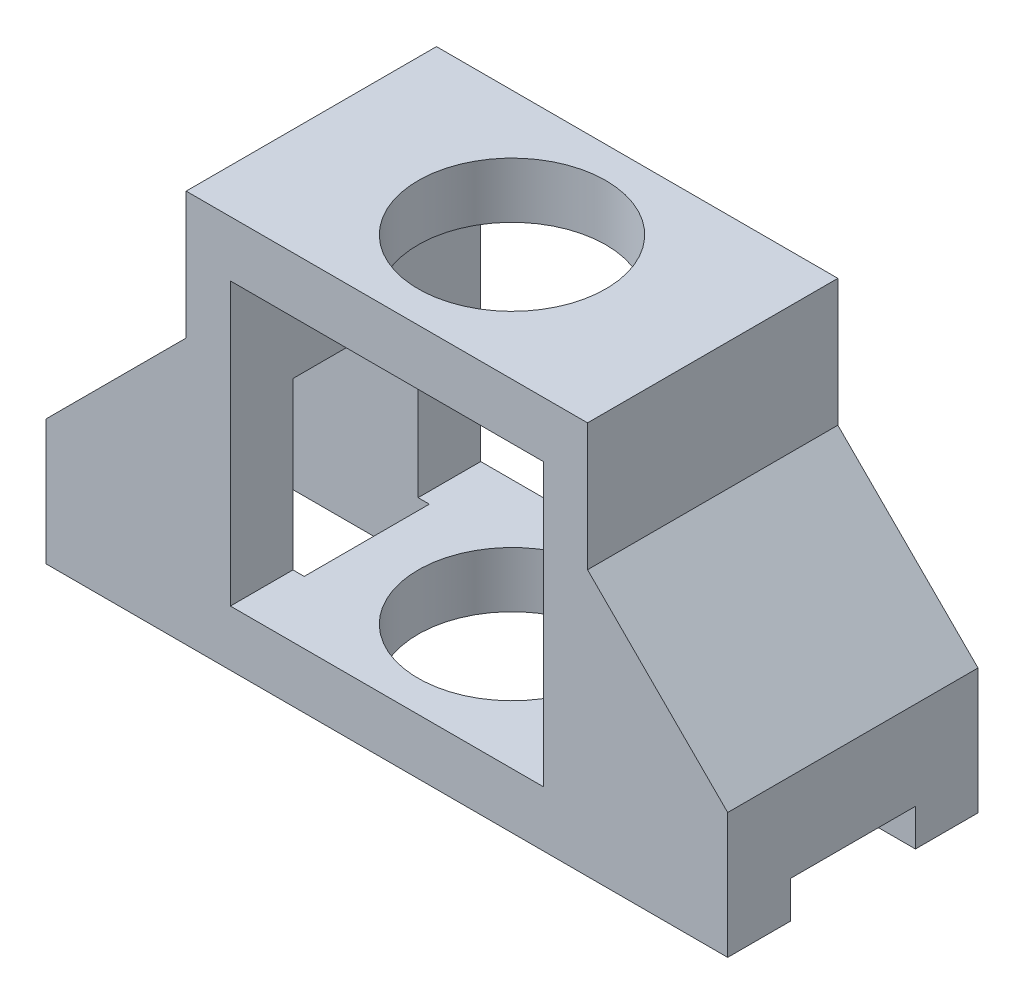
ISO-10303-21;
HEADER;
FILE_DESCRIPTION(('STEP AP214'),'2;1');
FILE_NAME('part.step','',(''),(''),'','','');
FILE_SCHEMA(('AUTOMOTIVE_DESIGN { 1 0 10303 214 1 1 1 1 }'));
ENDSEC;
DATA;
#1=APPLICATION_CONTEXT('core data for automotive mechanical design processes');
#2=APPLICATION_PROTOCOL_DEFINITION('international standard','automotive_design',2000,#1);
#3=PRODUCT_CONTEXT('',#1,'mechanical');
#4=PRODUCT('Part','Part','',(#3));
#5=PRODUCT_RELATED_PRODUCT_CATEGORY('part','',(#4));
#6=PRODUCT_DEFINITION_FORMATION('','',#4);
#7=PRODUCT_DEFINITION_CONTEXT('part definition',#1,'design');
#8=PRODUCT_DEFINITION('design','',#6,#7);
#9=PRODUCT_DEFINITION_SHAPE('','',#8);
#10=(LENGTH_UNIT() NAMED_UNIT(*) SI_UNIT(.MILLI.,.METRE.));
#11=(NAMED_UNIT(*) PLANE_ANGLE_UNIT() SI_UNIT($,.RADIAN.));
#12=(NAMED_UNIT(*) SI_UNIT($,.STERADIAN.) SOLID_ANGLE_UNIT());
#13=UNCERTAINTY_MEASURE_WITH_UNIT(LENGTH_MEASURE(1.E-05),#10,'distance_accuracy_value','');
#14=(GEOMETRIC_REPRESENTATION_CONTEXT(3) GLOBAL_UNCERTAINTY_ASSIGNED_CONTEXT((#13)) GLOBAL_UNIT_ASSIGNED_CONTEXT((#10,
#11,#12)) REPRESENTATION_CONTEXT('',''));
#15=CARTESIAN_POINT('',(0.,0.,0.));
#16=DIRECTION('',(0.,0.,1.));
#17=DIRECTION('',(1.,0.,0.));
#18=AXIS2_PLACEMENT_3D('',#15,#16,#17);
#19=CARTESIAN_POINT('',(69.1731378358659,99.125487956842,-25.4));
#20=DIRECTION('',(0.,1.,0.));
#21=DIRECTION('',(0.,0.,1.));
#22=AXIS2_PLACEMENT_3D('',#19,#20,#21);
#23=PLANE('',#22);
#24=CARTESIAN_POINT('',(0.,99.125487956842,0.));
#25=DIRECTION('',(0.,1.,0.));
#26=DIRECTION('',(0.,0.,1.));
#27=AXIS2_PLACEMENT_3D('',#24,#25,#26);
#28=CIRCLE('',#27,19.05);
#29=CARTESIAN_POINT('',(0.,99.125487956842,-19.05));
#30=VERTEX_POINT('',#29);
#31=EDGE_CURVE('E254',#30,#30,#28,.F.);
#32=ORIENTED_EDGE('',*,*,#31,.T.);
#33=EDGE_LOOP('',(#32));
#34=FACE_BOUND('',#33,.T.);
#35=DIRECTION('',(-1.,0.,0.));
#36=VECTOR('',#35,1.);
#37=CARTESIAN_POINT('',(69.1731378358659,99.125487956842,25.4));
#38=LINE('',#37,#36);
#39=CARTESIAN_POINT('',(40.7302561210692,99.125487956842,25.4));
#40=VERTEX_POINT('',#39);
#41=CARTESIAN_POINT('',(-40.7302561210692,99.125487956842,25.4));
#42=VERTEX_POINT('',#41);
#43=EDGE_CURVE('E261',#40,#42,#38,.T.);
#44=ORIENTED_EDGE('',*,*,#43,.F.);
#45=DIRECTION('',(0.,0.,1.));
#46=VECTOR('',#45,1.);
#47=CARTESIAN_POINT('',(40.7302561210692,99.125487956842,-25.4));
#48=LINE('',#47,#46);
#49=CARTESIAN_POINT('',(40.7302561210692,99.125487956842,-25.4));
#50=VERTEX_POINT('',#49);
#51=EDGE_CURVE('E63',#50,#40,#48,.T.);
#52=ORIENTED_EDGE('',*,*,#51,.F.);
#53=DIRECTION('',(-1.,0.,0.));
#54=VECTOR('',#53,1.);
#55=CARTESIAN_POINT('',(69.1731378358659,99.125487956842,-25.4));
#56=LINE('',#55,#54);
#57=CARTESIAN_POINT('',(-40.7302561210692,99.125487956842,-25.4));
#58=VERTEX_POINT('',#57);
#59=EDGE_CURVE('E239',#50,#58,#56,.T.);
#60=ORIENTED_EDGE('',*,*,#59,.T.);
#61=DIRECTION('',(0.,0.,1.));
#62=VECTOR('',#61,1.);
#63=CARTESIAN_POINT('',(-40.7302561210692,99.125487956842,-25.4));
#64=LINE('',#63,#62);
#65=EDGE_CURVE('E435',#58,#42,#64,.T.);
#66=ORIENTED_EDGE('',*,*,#65,.T.);
#67=EDGE_LOOP('',(#44,#52,#60,#66));
#68=FACE_BOUND('',#67,.T.);
#69=ADVANCED_FACE('F46',(#34,#68),#23,.T.);
#70=CARTESIAN_POINT('',(69.1731378358659,19.3936469520584,-25.4));
#71=DIRECTION('',(1.,0.,0.));
#72=DIRECTION('',(0.,0.,-1.));
#73=AXIS2_PLACEMENT_3D('',#70,#71,#72);
#74=PLANE('',#73);
#75=DIRECTION('',(0.,1.,0.));
#76=VECTOR('',#75,1.);
#77=CARTESIAN_POINT('',(69.1731378358659,19.3936469520584,-25.4));
#78=LINE('',#77,#76);
#79=CARTESIAN_POINT('',(69.1731378358659,19.3936469520584,-25.4));
#80=VERTEX_POINT('',#79);
#81=CARTESIAN_POINT('',(69.1731378358659,44.8644888905493,-25.4));
#82=VERTEX_POINT('',#81);
#83=EDGE_CURVE('E228',#80,#82,#78,.T.);
#84=ORIENTED_EDGE('',*,*,#83,.T.);
#85=DIRECTION('',(0.,0.,1.));
#86=VECTOR('',#85,1.);
#87=CARTESIAN_POINT('',(69.1731378358659,44.8644888905493,-25.4));
#88=LINE('',#87,#86);
#89=CARTESIAN_POINT('',(69.1731378358659,44.8644888905493,25.4));
#90=VERTEX_POINT('',#89);
#91=EDGE_CURVE('E208',#82,#90,#88,.T.);
#92=ORIENTED_EDGE('',*,*,#91,.T.);
#93=DIRECTION('',(0.,1.,0.));
#94=VECTOR('',#93,1.);
#95=CARTESIAN_POINT('',(69.1731378358659,19.3936469520584,25.4));
#96=LINE('',#95,#94);
#97=CARTESIAN_POINT('',(69.1731378358659,19.3936469520584,25.4));
#98=VERTEX_POINT('',#97);
#99=EDGE_CURVE('E258',#98,#90,#96,.T.);
#100=ORIENTED_EDGE('',*,*,#99,.F.);
#101=DIRECTION('',(0.,0.,1.));
#102=VECTOR('',#101,1.);
#103=CARTESIAN_POINT('',(69.1731378358659,19.3936469520584,-25.4));
#104=LINE('',#103,#102);
#105=CARTESIAN_POINT('',(69.1731378358659,19.3936469520584,12.7));
#106=VERTEX_POINT('',#105);
#107=EDGE_CURVE('E267',#106,#98,#104,.T.);
#108=ORIENTED_EDGE('',*,*,#107,.F.);
#109=DIRECTION('',(0.,-1.,0.));
#110=VECTOR('',#109,1.);
#111=CARTESIAN_POINT('',(69.1731378358659,19.3936469520584,12.7));
#112=LINE('',#111,#110);
#113=CARTESIAN_POINT('',(69.1731378358659,26.903976648411,12.7));
#114=VERTEX_POINT('',#113);
#115=EDGE_CURVE('E367',#114,#106,#112,.T.);
#116=ORIENTED_EDGE('',*,*,#115,.F.);
#117=DIRECTION('',(0.,0.,-1.));
#118=VECTOR('',#117,1.);
#119=CARTESIAN_POINT('',(69.1731378358659,26.903976648411,-25.4));
#120=LINE('',#119,#118);
#121=CARTESIAN_POINT('',(69.1731378358659,26.903976648411,-12.7));
#122=VERTEX_POINT('',#121);
#123=EDGE_CURVE('E294',#114,#122,#120,.T.);
#124=ORIENTED_EDGE('',*,*,#123,.T.);
#125=DIRECTION('',(0.,-1.,0.));
#126=VECTOR('',#125,1.);
#127=CARTESIAN_POINT('',(69.1731378358659,19.3936469520584,-12.7));
#128=LINE('',#127,#126);
#129=CARTESIAN_POINT('',(69.1731378358659,19.3936469520584,-12.7));
#130=VERTEX_POINT('',#129);
#131=EDGE_CURVE('E359',#122,#130,#128,.T.);
#132=ORIENTED_EDGE('',*,*,#131,.T.);
#133=EDGE_CURVE('E237',#80,#130,#104,.T.);
#134=ORIENTED_EDGE('',*,*,#133,.F.);
#135=EDGE_LOOP('',(#84,#92,#100,#108,#116,#124,#132,#134));
#136=FACE_BOUND('',#135,.T.);
#137=ADVANCED_FACE('F234',(#136),#74,.T.);
#138=CARTESIAN_POINT('',(0.,0.,-25.4));
#139=DIRECTION('',(0.,0.,1.));
#140=DIRECTION('',(1.,0.,0.));
#141=AXIS2_PLACEMENT_3D('',#138,#139,#140);
#142=PLANE('',#141);
#143=DIRECTION('',(1.,0.,0.));
#144=VECTOR('',#143,1.);
#145=CARTESIAN_POINT('',(-31.75,30.6845674544502,-25.4));
#146=LINE('',#145,#144);
#147=CARTESIAN_POINT('',(-31.75,30.6845674544502,-25.4));
#148=VERTEX_POINT('',#147);
#149=CARTESIAN_POINT('',(31.75,30.6845674544502,-25.4));
#150=VERTEX_POINT('',#149);
#151=EDGE_CURVE('E455',#148,#150,#146,.T.);
#152=ORIENTED_EDGE('',*,*,#151,.T.);
#153=DIRECTION('',(0.,1.,0.));
#154=VECTOR('',#153,1.);
#155=CARTESIAN_POINT('',(31.75,30.6845674544502,-25.4));
#156=LINE('',#155,#154);
#157=CARTESIAN_POINT('',(31.75,87.8345674544502,-25.4));
#158=VERTEX_POINT('',#157);
#159=EDGE_CURVE('E442',#150,#158,#156,.T.);
#160=ORIENTED_EDGE('',*,*,#159,.T.);
#161=DIRECTION('',(-1.,0.,0.));
#162=VECTOR('',#161,1.);
#163=CARTESIAN_POINT('',(-31.75,87.8345674544502,-25.4));
#164=LINE('',#163,#162);
#165=CARTESIAN_POINT('',(-31.75,87.8345674544502,-25.4));
#166=VERTEX_POINT('',#165);
#167=EDGE_CURVE('E446',#158,#166,#164,.T.);
#168=ORIENTED_EDGE('',*,*,#167,.T.);
#169=DIRECTION('',(0.,-1.,0.));
#170=VECTOR('',#169,1.);
#171=CARTESIAN_POINT('',(-31.75,30.6845674544502,-25.4));
#172=LINE('',#171,#170);
#173=EDGE_CURVE('E451',#166,#148,#172,.T.);
#174=ORIENTED_EDGE('',*,*,#173,.T.);
#175=EDGE_LOOP('',(#152,#160,#168,#174));
#176=FACE_BOUND('',#175,.T.);
#177=DIRECTION('',(-0.707106781186548,0.707106781186547,0.));
#178=VECTOR('',#177,1.);
#179=CARTESIAN_POINT('',(57.0188133632076,57.0188133632076,-25.4));
#180=LINE('',#179,#178);
#181=CARTESIAN_POINT('',(40.7302561210692,73.307370605346,-25.4));
#182=VERTEX_POINT('',#181);
#183=EDGE_CURVE('E212',#82,#182,#180,.T.);
#184=ORIENTED_EDGE('',*,*,#183,.F.);
#185=ORIENTED_EDGE('',*,*,#83,.F.);
#186=DIRECTION('',(1.,0.,0.));
#187=VECTOR('',#186,1.);
#188=CARTESIAN_POINT('',(69.1731378358659,19.3936469520584,-25.4));
#189=LINE('',#188,#187);
#190=CARTESIAN_POINT('',(-69.1731378358659,19.3936469520584,-25.4));
#191=VERTEX_POINT('',#190);
#192=EDGE_CURVE('E240',#191,#80,#189,.T.);
#193=ORIENTED_EDGE('',*,*,#192,.F.);
#194=DIRECTION('',(0.,-1.,0.));
#195=VECTOR('',#194,1.);
#196=CARTESIAN_POINT('',(-69.1731378358659,19.3936469520584,-25.4));
#197=LINE('',#196,#195);
#198=CARTESIAN_POINT('',(-69.1731378358659,44.8644888905493,-25.4));
#199=VERTEX_POINT('',#198);
#200=EDGE_CURVE('E246',#199,#191,#197,.T.);
#201=ORIENTED_EDGE('',*,*,#200,.F.);
#202=DIRECTION('',(0.707106781186548,0.707106781186547,0.));
#203=VECTOR('',#202,1.);
#204=CARTESIAN_POINT('',(-57.0188133632076,57.0188133632076,-25.4));
#205=LINE('',#204,#203);
#206=CARTESIAN_POINT('',(-40.7302561210692,73.307370605346,-25.4));
#207=VERTEX_POINT('',#206);
#208=EDGE_CURVE('E425',#199,#207,#205,.T.);
#209=ORIENTED_EDGE('',*,*,#208,.T.);
#210=DIRECTION('',(0.,1.,0.));
#211=VECTOR('',#210,1.);
#212=CARTESIAN_POINT('',(-40.7302561210692,0.,-25.4));
#213=LINE('',#212,#211);
#214=EDGE_CURVE('E429',#207,#58,#213,.T.);
#215=ORIENTED_EDGE('',*,*,#214,.T.);
#216=ORIENTED_EDGE('',*,*,#59,.F.);
#217=DIRECTION('',(0.,1.,0.));
#218=VECTOR('',#217,1.);
#219=CARTESIAN_POINT('',(40.7302561210692,0.,-25.4));
#220=LINE('',#219,#218);
#221=EDGE_CURVE('E221',#182,#50,#220,.T.);
#222=ORIENTED_EDGE('',*,*,#221,.F.);
#223=EDGE_LOOP('',(#184,#185,#193,#201,#209,#215,#216,#222));
#224=FACE_BOUND('',#223,.T.);
#225=ADVANCED_FACE('F226',(#176,#224),#142,.F.);
#226=CARTESIAN_POINT('',(0.,0.,25.4));
#227=DIRECTION('',(0.,0.,1.));
#228=DIRECTION('',(1.,0.,0.));
#229=AXIS2_PLACEMENT_3D('',#226,#227,#228);
#230=PLANE('',#229);
#231=DIRECTION('',(0.,1.,0.));
#232=VECTOR('',#231,1.);
#233=CARTESIAN_POINT('',(31.75,30.6845674544502,25.4));
#234=LINE('',#233,#232);
#235=CARTESIAN_POINT('',(31.75,30.6845674544502,25.4));
#236=VERTEX_POINT('',#235);
#237=CARTESIAN_POINT('',(31.75,87.8345674544502,25.4));
#238=VERTEX_POINT('',#237);
#239=EDGE_CURVE('E434',#236,#238,#234,.T.);
#240=ORIENTED_EDGE('',*,*,#239,.F.);
#241=DIRECTION('',(1.,0.,0.));
#242=VECTOR('',#241,1.);
#243=CARTESIAN_POINT('',(-31.75,30.6845674544502,25.4));
#244=LINE('',#243,#242);
#245=CARTESIAN_POINT('',(-31.75,30.6845674544502,25.4));
#246=VERTEX_POINT('',#245);
#247=EDGE_CURVE('E447',#246,#236,#244,.T.);
#248=ORIENTED_EDGE('',*,*,#247,.F.);
#249=DIRECTION('',(0.,-1.,0.));
#250=VECTOR('',#249,1.);
#251=CARTESIAN_POINT('',(-31.75,30.6845674544502,25.4));
#252=LINE('',#251,#250);
#253=CARTESIAN_POINT('',(-31.75,87.8345674544502,25.4));
#254=VERTEX_POINT('',#253);
#255=EDGE_CURVE('E466',#254,#246,#252,.T.);
#256=ORIENTED_EDGE('',*,*,#255,.F.);
#257=DIRECTION('',(-1.,0.,0.));
#258=VECTOR('',#257,1.);
#259=CARTESIAN_POINT('',(-31.75,87.8345674544502,25.4));
#260=LINE('',#259,#258);
#261=EDGE_CURVE('E462',#238,#254,#260,.T.);
#262=ORIENTED_EDGE('',*,*,#261,.F.);
#263=EDGE_LOOP('',(#240,#248,#256,#262));
#264=FACE_BOUND('',#263,.T.);
#265=ORIENTED_EDGE('',*,*,#99,.T.);
#266=DIRECTION('',(-0.707106781186548,0.707106781186547,0.));
#267=VECTOR('',#266,1.);
#268=CARTESIAN_POINT('',(57.0188133632076,57.0188133632076,25.4));
#269=LINE('',#268,#267);
#270=CARTESIAN_POINT('',(40.7302561210692,73.307370605346,25.4));
#271=VERTEX_POINT('',#270);
#272=EDGE_CURVE('E215',#90,#271,#269,.T.);
#273=ORIENTED_EDGE('',*,*,#272,.T.);
#274=DIRECTION('',(0.,1.,0.));
#275=VECTOR('',#274,1.);
#276=CARTESIAN_POINT('',(40.7302561210692,0.,25.4));
#277=LINE('',#276,#275);
#278=EDGE_CURVE('E232',#271,#40,#277,.T.);
#279=ORIENTED_EDGE('',*,*,#278,.T.);
#280=ORIENTED_EDGE('',*,*,#43,.T.);
#281=DIRECTION('',(0.,1.,0.));
#282=VECTOR('',#281,1.);
#283=CARTESIAN_POINT('',(-40.7302561210692,0.,25.4));
#284=LINE('',#283,#282);
#285=CARTESIAN_POINT('',(-40.7302561210692,73.307370605346,25.4));
#286=VERTEX_POINT('',#285);
#287=EDGE_CURVE('E419',#286,#42,#284,.T.);
#288=ORIENTED_EDGE('',*,*,#287,.F.);
#289=DIRECTION('',(0.707106781186548,0.707106781186547,0.));
#290=VECTOR('',#289,1.);
#291=CARTESIAN_POINT('',(-57.0188133632076,57.0188133632076,25.4));
#292=LINE('',#291,#290);
#293=CARTESIAN_POINT('',(-69.1731378358659,44.8644888905493,25.4));
#294=VERTEX_POINT('',#293);
#295=EDGE_CURVE('E71',#294,#286,#292,.T.);
#296=ORIENTED_EDGE('',*,*,#295,.F.);
#297=DIRECTION('',(0.,-1.,0.));
#298=VECTOR('',#297,1.);
#299=CARTESIAN_POINT('',(-69.1731378358659,19.3936469520584,25.4));
#300=LINE('',#299,#298);
#301=CARTESIAN_POINT('',(-69.1731378358659,19.3936469520584,25.4));
#302=VERTEX_POINT('',#301);
#303=EDGE_CURVE('E250',#294,#302,#300,.T.);
#304=ORIENTED_EDGE('',*,*,#303,.T.);
#305=DIRECTION('',(1.,0.,0.));
#306=VECTOR('',#305,1.);
#307=CARTESIAN_POINT('',(69.1731378358659,19.3936469520584,25.4));
#308=LINE('',#307,#306);
#309=EDGE_CURVE('E253',#302,#98,#308,.T.);
#310=ORIENTED_EDGE('',*,*,#309,.T.);
#311=EDGE_LOOP('',(#265,#273,#279,#280,#288,#296,#304,#310));
#312=FACE_BOUND('',#311,.T.);
#313=ADVANCED_FACE('F416',(#264,#312),#230,.T.);
#314=CARTESIAN_POINT('',(0.,152.4,0.));
#315=DIRECTION('',(0.,-1.,0.));
#316=DIRECTION('',(0.,0.,-1.));
#317=AXIS2_PLACEMENT_3D('',#314,#315,#316);
#318=CYLINDRICAL_SURFACE('',#317,19.05);
#319=CARTESIAN_POINT('',(0.,30.6845674544502,0.));
#320=DIRECTION('',(0.,-1.,0.));
#321=DIRECTION('',(0.,0.,-1.));
#322=AXIS2_PLACEMENT_3D('',#319,#320,#321);
#323=CIRCLE('',#322,19.05);
#324=CARTESIAN_POINT('',(0.,30.6845674544502,-19.05));
#325=VERTEX_POINT('',#324);
#326=EDGE_CURVE('E503',#325,#325,#323,.T.);
#327=CARTESIAN_POINT('',(0.,19.3936469520584,0.));
#328=DIRECTION('',(0.,-1.,0.));
#329=DIRECTION('',(1.,0.,0.));
#330=AXIS2_PLACEMENT_3D('',#327,#328,#329);
#331=CIRCLE('',#330,19.05);
#332=CARTESIAN_POINT('',(0.,19.3936469520584,-19.05));
#333=VERTEX_POINT('',#332);
#334=EDGE_CURVE('E295',#333,#333,#331,.F.);
#335=CARTESIAN_POINT('',(0.,30.6845674544502,-19.05));
#336=CARTESIAN_POINT('',(0.,30.566953699217,-19.05));
#337=CARTESIAN_POINT('',(0.,30.4493399439837,-19.05));
#338=CARTESIAN_POINT('',(0.,30.2141124335172,-19.05));
#339=CARTESIAN_POINT('',(0.,30.096498678284,-19.05));
#340=CARTESIAN_POINT('',(0.,29.8612711678175,-19.05));
#341=CARTESIAN_POINT('',(0.,29.7436574125842,-19.05));
#342=CARTESIAN_POINT('',(0.,29.5084299021177,-19.05));
#343=CARTESIAN_POINT('',(0.,29.3908161468845,-19.05));
#344=CARTESIAN_POINT('',(0.,29.155588636418,-19.05));
#345=CARTESIAN_POINT('',(0.,29.0379748811848,-19.05));
#346=CARTESIAN_POINT('',(0.,28.8027473707183,-19.05));
#347=CARTESIAN_POINT('',(0.,28.685133615485,-19.05));
#348=CARTESIAN_POINT('',(0.,28.4499061050185,-19.05));
#349=CARTESIAN_POINT('',(0.,28.3322923497853,-19.05));
#350=CARTESIAN_POINT('',(0.,28.0970648393188,-19.05));
#351=CARTESIAN_POINT('',(0.,27.9794510840855,-19.05));
#352=CARTESIAN_POINT('',(0.,27.744223573619,-19.05));
#353=CARTESIAN_POINT('',(0.,27.6266098183858,-19.05));
#354=CARTESIAN_POINT('',(0.,27.3913823079193,-19.05));
#355=CARTESIAN_POINT('',(0.,27.2737685526861,-19.05));
#356=CARTESIAN_POINT('',(0.,27.0385410422196,-19.05));
#357=CARTESIAN_POINT('',(0.,26.9209272869863,-19.05));
#358=CARTESIAN_POINT('',(0.,26.6856997765198,-19.05));
#359=CARTESIAN_POINT('',(0.,26.5680860212866,-19.05));
#360=CARTESIAN_POINT('',(0.,26.3328585108201,-19.05));
#361=CARTESIAN_POINT('',(0.,26.2152447555868,-19.05));
#362=CARTESIAN_POINT('',(0.,25.9800172451203,-19.05));
#363=CARTESIAN_POINT('',(0.,25.8624034898871,-19.05));
#364=CARTESIAN_POINT('',(0.,25.6271759794206,-19.05));
#365=CARTESIAN_POINT('',(0.,25.5095622241873,-19.05));
#366=CARTESIAN_POINT('',(0.,25.2743347137208,-19.05));
#367=CARTESIAN_POINT('',(0.,25.1567209584876,-19.05));
#368=CARTESIAN_POINT('',(0.,24.9214934480211,-19.05));
#369=CARTESIAN_POINT('',(0.,24.8038796927878,-19.05));
#370=CARTESIAN_POINT('',(0.,24.5686521823213,-19.05));
#371=CARTESIAN_POINT('',(0.,24.4510384270881,-19.05));
#372=CARTESIAN_POINT('',(0.,24.2158109166216,-19.05));
#373=CARTESIAN_POINT('',(0.,24.0981971613884,-19.05));
#374=CARTESIAN_POINT('',(0.,23.8629696509219,-19.05));
#375=CARTESIAN_POINT('',(0.,23.7453558956886,-19.05));
#376=CARTESIAN_POINT('',(0.,23.5101283852221,-19.05));
#377=CARTESIAN_POINT('',(0.,23.3925146299889,-19.05));
#378=CARTESIAN_POINT('',(0.,23.1572871195224,-19.05));
#379=CARTESIAN_POINT('',(0.,23.0396733642891,-19.05));
#380=CARTESIAN_POINT('',(0.,22.8044458538226,-19.05));
#381=CARTESIAN_POINT('',(0.,22.6868320985894,-19.05));
#382=CARTESIAN_POINT('',(0.,22.4516045881229,-19.05));
#383=CARTESIAN_POINT('',(0.,22.3339908328896,-19.05));
#384=CARTESIAN_POINT('',(0.,22.0987633224231,-19.05));
#385=CARTESIAN_POINT('',(0.,21.9811495671899,-19.05));
#386=CARTESIAN_POINT('',(0.,21.7459220567234,-19.05));
#387=CARTESIAN_POINT('',(0.,21.6283083014901,-19.05));
#388=CARTESIAN_POINT('',(0.,21.3930807910236,-19.05));
#389=CARTESIAN_POINT('',(0.,21.2754670357904,-19.05));
#390=CARTESIAN_POINT('',(0.,21.0402395253239,-19.05));
#391=CARTESIAN_POINT('',(0.,20.9226257700906,-19.05));
#392=CARTESIAN_POINT('',(0.,20.6873982596241,-19.05));
#393=CARTESIAN_POINT('',(0.,20.5697845043909,-19.05));
#394=CARTESIAN_POINT('',(0.,20.3345569939244,-19.05));
#395=CARTESIAN_POINT('',(0.,20.2169432386912,-19.05));
#396=CARTESIAN_POINT('',(0.,19.9817157282247,-19.05));
#397=CARTESIAN_POINT('',(0.,19.8641019729914,-19.05));
#398=CARTESIAN_POINT('',(0.,19.6288744625249,-19.05));
#399=CARTESIAN_POINT('',(0.,19.5112607072917,-19.05));
#400=CARTESIAN_POINT('',(0.,19.3936469520584,-19.05));
#401=B_SPLINE_CURVE_WITH_KNOTS('',3,(#335,#336,#337,#338,#339,#340,#341,#342,#343,#344,#345,
#346,#347,#348,#349,#350,#351,#352,#353,#354,#355,#356,#357,#358,#359,#360,#361,#362,#363,#364,
#365,#366,#367,#368,#369,#370,#371,#372,#373,#374,#375,#376,#377,#378,#379,#380,#381,#382,#383,
#384,#385,#386,#387,#388,#389,#390,#391,#392,#393,#394,#395,#396,#397,#398,#399,#400),
.UNSPECIFIED.,.F.,.F.,(4,2,2,2,2,2,2,2,2,2,2,2,2,2,2,2,2,2,2,2,2,2,2,2,2,2,2,2,2,2,2,2,4),(0.,
0.352841265699746,0.705682531399493,1.05852379709924,1.41136506279899,1.76420632849872,
2.11704759419846,2.46988885989821,2.82273012559796,3.1755713912977,3.52841265699742,
3.88125392269718,4.23409518839692,4.58693645409668,4.93977771979641,5.29261898549617,
5.6454602511959,5.99830151689564,6.35114278259539,6.70398404829513,7.05682531399489,
7.40966657969462,7.76250784539438,8.11534911109411,8.46819037679385,8.82103164249361,
9.17387290819334,9.5267141738931,9.87955543959283,10.2323967052926,10.5852379709923,
10.9380792366921,11.2909205023918),.UNSPECIFIED.);
#402=EDGE_CURVE('BSEAM522',#325,#333,#401,.T.);
#403=ORIENTED_EDGE('',*,*,#326,.F.);
#404=ORIENTED_EDGE('',*,*,#334,.F.);
#405=ORIENTED_EDGE('',*,*,#402,.T.);
#406=ORIENTED_EDGE('',*,*,#402,.F.);
#407=EDGE_LOOP('',(#403,#405,#404,#406));
#408=FACE_BOUND('',#407,.T.);
#409=ADVANCED_FACE('F522',(#408),#318,.F.);
#410=CARTESIAN_POINT('',(69.1731378358659,19.3936469520584,-25.4));
#411=DIRECTION('',(0.,-1.,0.));
#412=DIRECTION('',(1.,0.,0.));
#413=AXIS2_PLACEMENT_3D('',#410,#411,#412);
#414=PLANE('',#413);
#415=DIRECTION('',(-1.,0.,0.));
#416=VECTOR('',#415,1.);
#417=CARTESIAN_POINT('',(69.1731378358659,19.3936469520584,12.7));
#418=LINE('',#417,#416);
#419=CARTESIAN_POINT('',(-40.7624430479406,19.3936469520584,12.7));
#420=VERTEX_POINT('',#419);
#421=CARTESIAN_POINT('',(-69.1731378358659,19.3936469520584,12.7));
#422=VERTEX_POINT('',#421);
#423=EDGE_CURVE('E291',#420,#422,#418,.T.);
#424=ORIENTED_EDGE('',*,*,#423,.F.);
#425=DIRECTION('',(0.,0.,1.));
#426=VECTOR('',#425,1.);
#427=CARTESIAN_POINT('',(-40.7624430479406,19.3936469520584,-25.4));
#428=LINE('',#427,#426);
#429=CARTESIAN_POINT('',(-40.7624430479406,19.3936469520584,-12.7));
#430=VERTEX_POINT('',#429);
#431=EDGE_CURVE('E283',#430,#420,#428,.T.);
#432=ORIENTED_EDGE('',*,*,#431,.F.);
#433=DIRECTION('',(-1.,0.,0.));
#434=VECTOR('',#433,1.);
#435=CARTESIAN_POINT('',(69.1731378358659,19.3936469520584,-12.7));
#436=LINE('',#435,#434);
#437=CARTESIAN_POINT('',(-69.1731378358659,19.3936469520584,-12.7));
#438=VERTEX_POINT('',#437);
#439=EDGE_CURVE('E287',#430,#438,#436,.T.);
#440=ORIENTED_EDGE('',*,*,#439,.T.);
#441=DIRECTION('',(0.,0.,1.));
#442=VECTOR('',#441,1.);
#443=CARTESIAN_POINT('',(-69.1731378358659,19.3936469520584,-25.4));
#444=LINE('',#443,#442);
#445=EDGE_CURVE('E268',#191,#438,#444,.T.);
#446=ORIENTED_EDGE('',*,*,#445,.F.);
#447=ORIENTED_EDGE('',*,*,#192,.T.);
#448=ORIENTED_EDGE('',*,*,#133,.T.);
#449=DIRECTION('',(-1.,0.,0.));
#450=VECTOR('',#449,1.);
#451=CARTESIAN_POINT('',(69.1731378358659,19.3936469520584,-12.7));
#452=LINE('',#451,#450);
#453=CARTESIAN_POINT('',(40.7624430479406,19.3936469520584,-12.7));
#454=VERTEX_POINT('',#453);
#455=EDGE_CURVE('E275',#130,#454,#452,.T.);
#456=ORIENTED_EDGE('',*,*,#455,.T.);
#457=DIRECTION('',(0.,0.,1.));
#458=VECTOR('',#457,1.);
#459=CARTESIAN_POINT('',(40.7624430479405,19.3936469520584,-25.4));
#460=LINE('',#459,#458);
#461=CARTESIAN_POINT('',(40.7624430479405,19.3936469520584,12.7));
#462=VERTEX_POINT('',#461);
#463=EDGE_CURVE('E266',#454,#462,#460,.T.);
#464=ORIENTED_EDGE('',*,*,#463,.T.);
#465=DIRECTION('',(-1.,0.,0.));
#466=VECTOR('',#465,1.);
#467=CARTESIAN_POINT('',(69.1731378358659,19.3936469520584,12.7));
#468=LINE('',#467,#466);
#469=EDGE_CURVE('E279',#106,#462,#468,.T.);
#470=ORIENTED_EDGE('',*,*,#469,.F.);
#471=ORIENTED_EDGE('',*,*,#107,.T.);
#472=ORIENTED_EDGE('',*,*,#309,.F.);
#473=EDGE_CURVE('E244',#422,#302,#444,.T.);
#474=ORIENTED_EDGE('',*,*,#473,.F.);
#475=EDGE_LOOP('',(#424,#432,#440,#446,#447,#448,#456,#464,#470,#471,#472,#474));
#476=FACE_BOUND('',#475,.T.);
#477=ORIENTED_EDGE('',*,*,#334,.T.);
#478=EDGE_LOOP('',(#477));
#479=FACE_BOUND('',#478,.T.);
#480=ADVANCED_FACE('F388',(#476,#479),#414,.T.);
#481=CARTESIAN_POINT('',(-69.1731378358659,19.3936469520584,-25.4));
#482=DIRECTION('',(-1.,0.,0.));
#483=DIRECTION('',(0.,0.,1.));
#484=AXIS2_PLACEMENT_3D('',#481,#482,#483);
#485=PLANE('',#484);
#486=DIRECTION('',(0.,0.,1.));
#487=VECTOR('',#486,1.);
#488=CARTESIAN_POINT('',(-69.1731378358659,44.8644888905493,-25.4));
#489=LINE('',#488,#487);
#490=EDGE_CURVE('E384',#199,#294,#489,.T.);
#491=ORIENTED_EDGE('',*,*,#490,.F.);
#492=ORIENTED_EDGE('',*,*,#200,.T.);
#493=ORIENTED_EDGE('',*,*,#445,.T.);
#494=DIRECTION('',(0.,1.,0.));
#495=VECTOR('',#494,1.);
#496=CARTESIAN_POINT('',(-69.1731378358659,19.3936469520584,-12.7));
#497=LINE('',#496,#495);
#498=CARTESIAN_POINT('',(-69.1731378358659,26.9039766484109,-12.7));
#499=VERTEX_POINT('',#498);
#500=EDGE_CURVE('E370',#438,#499,#497,.T.);
#501=ORIENTED_EDGE('',*,*,#500,.T.);
#502=DIRECTION('',(0.,0.,-1.));
#503=VECTOR('',#502,1.);
#504=CARTESIAN_POINT('',(-69.1731378358659,26.9039766484109,-25.4));
#505=LINE('',#504,#503);
#506=CARTESIAN_POINT('',(-69.1731378358659,26.9039766484109,12.7));
#507=VERTEX_POINT('',#506);
#508=EDGE_CURVE('E303',#507,#499,#505,.T.);
#509=ORIENTED_EDGE('',*,*,#508,.F.);
#510=DIRECTION('',(0.,1.,0.));
#511=VECTOR('',#510,1.);
#512=CARTESIAN_POINT('',(-69.1731378358659,19.3936469520584,12.7));
#513=LINE('',#512,#511);
#514=EDGE_CURVE('E299',#422,#507,#513,.T.);
#515=ORIENTED_EDGE('',*,*,#514,.F.);
#516=ORIENTED_EDGE('',*,*,#473,.T.);
#517=ORIENTED_EDGE('',*,*,#303,.F.);
#518=EDGE_LOOP('',(#491,#492,#493,#501,#509,#515,#516,#517));
#519=FACE_BOUND('',#518,.T.);
#520=ADVANCED_FACE('F48',(#519),#485,.T.);
#521=CARTESIAN_POINT('',(0.,87.8345674544502,0.));
#522=DIRECTION('',(0.,1.,0.));
#523=DIRECTION('',(0.,0.,1.));
#524=AXIS2_PLACEMENT_3D('',#521,#522,#523);
#525=CIRCLE('',#524,19.05);
#526=CARTESIAN_POINT('',(0.,87.8345674544502,-19.05));
#527=VERTEX_POINT('',#526);
#528=EDGE_CURVE('E50',#527,#527,#525,.T.);
#529=CARTESIAN_POINT('',(0.,87.8345674544502,-19.05));
#530=CARTESIAN_POINT('',(0.,87.9521812096835,-19.05));
#531=CARTESIAN_POINT('',(0.,88.0697949649167,-19.05));
#532=CARTESIAN_POINT('',(0.,88.3050224753832,-19.05));
#533=CARTESIAN_POINT('',(0.,88.4226362306165,-19.05));
#534=CARTESIAN_POINT('',(0.,88.657863741083,-19.05));
#535=CARTESIAN_POINT('',(0.,88.7754774963162,-19.05));
#536=CARTESIAN_POINT('',(0.,89.0107050067827,-19.05));
#537=CARTESIAN_POINT('',(0.,89.128318762016,-19.05));
#538=CARTESIAN_POINT('',(0.,89.3635462724824,-19.05));
#539=CARTESIAN_POINT('',(0.,89.4811600277157,-19.05));
#540=CARTESIAN_POINT('',(0.,89.7163875381822,-19.05));
#541=CARTESIAN_POINT('',(0.,89.8340012934154,-19.05));
#542=CARTESIAN_POINT('',(0.,90.0692288038819,-19.05));
#543=CARTESIAN_POINT('',(0.,90.1868425591152,-19.05));
#544=CARTESIAN_POINT('',(0.,90.4220700695817,-19.05));
#545=CARTESIAN_POINT('',(0.,90.5396838248149,-19.05));
#546=CARTESIAN_POINT('',(0.,90.7749113352814,-19.05));
#547=CARTESIAN_POINT('',(0.,90.8925250905147,-19.05));
#548=CARTESIAN_POINT('',(0.,91.1277526009812,-19.05));
#549=CARTESIAN_POINT('',(0.,91.2453663562144,-19.05));
#550=CARTESIAN_POINT('',(0.,91.4805938666809,-19.05));
#551=CARTESIAN_POINT('',(0.,91.5982076219141,-19.05));
#552=CARTESIAN_POINT('',(0.,91.8334351323806,-19.05));
#553=CARTESIAN_POINT('',(0.,91.9510488876139,-19.05));
#554=CARTESIAN_POINT('',(0.,92.1862763980804,-19.05));
#555=CARTESIAN_POINT('',(0.,92.3038901533136,-19.05));
#556=CARTESIAN_POINT('',(0.,92.5391176637801,-19.05));
#557=CARTESIAN_POINT('',(0.,92.6567314190134,-19.05));
#558=CARTESIAN_POINT('',(0.,92.8919589294799,-19.05));
#559=CARTESIAN_POINT('',(0.,93.0095726847131,-19.05));
#560=CARTESIAN_POINT('',(0.,93.2448001951796,-19.05));
#561=CARTESIAN_POINT('',(0.,93.3624139504129,-19.05));
#562=CARTESIAN_POINT('',(0.,93.5976414608794,-19.05));
#563=CARTESIAN_POINT('',(0.,93.7152552161126,-19.05));
#564=CARTESIAN_POINT('',(0.,93.9504827265791,-19.05));
#565=CARTESIAN_POINT('',(0.,94.0680964818124,-19.05));
#566=CARTESIAN_POINT('',(0.,94.3033239922788,-19.05));
#567=CARTESIAN_POINT('',(0.,94.4209377475121,-19.05));
#568=CARTESIAN_POINT('',(0.,94.6561652579786,-19.05));
#569=CARTESIAN_POINT('',(0.,94.7737790132119,-19.05));
#570=CARTESIAN_POINT('',(0.,95.0090065236783,-19.05));
#571=CARTESIAN_POINT('',(0.,95.1266202789116,-19.05));
#572=CARTESIAN_POINT('',(0.,95.3618477893781,-19.05));
#573=CARTESIAN_POINT('',(0.,95.4794615446113,-19.05));
#574=CARTESIAN_POINT('',(0.,95.7146890550778,-19.05));
#575=CARTESIAN_POINT('',(0.,95.8323028103111,-19.05));
#576=CARTESIAN_POINT('',(0.,96.0675303207776,-19.05));
#577=CARTESIAN_POINT('',(0.,96.1851440760108,-19.05));
#578=CARTESIAN_POINT('',(0.,96.4203715864773,-19.05));
#579=CARTESIAN_POINT('',(0.,96.5379853417106,-19.05));
#580=CARTESIAN_POINT('',(0.,96.7732128521771,-19.05));
#581=CARTESIAN_POINT('',(0.,96.8908266074103,-19.05));
#582=CARTESIAN_POINT('',(0.,97.1260541178768,-19.05));
#583=CARTESIAN_POINT('',(0.,97.2436678731101,-19.05));
#584=CARTESIAN_POINT('',(0.,97.4788953835766,-19.05));
#585=CARTESIAN_POINT('',(0.,97.5965091388098,-19.05));
#586=CARTESIAN_POINT('',(0.,97.8317366492763,-19.05));
#587=CARTESIAN_POINT('',(0.,97.9493504045095,-19.05));
#588=CARTESIAN_POINT('',(0.,98.184577914976,-19.05));
#589=CARTESIAN_POINT('',(0.,98.3021916702093,-19.05));
#590=CARTESIAN_POINT('',(0.,98.5374191806758,-19.05));
#591=CARTESIAN_POINT('',(0.,98.655032935909,-19.05));
#592=CARTESIAN_POINT('',(0.,98.8902604463755,-19.05));
#593=CARTESIAN_POINT('',(0.,99.0078742016088,-19.05));
#594=CARTESIAN_POINT('',(0.,99.125487956842,-19.05));
#595=B_SPLINE_CURVE_WITH_KNOTS('',3,(#529,#530,#531,#532,#533,#534,#535,#536,#537,#538,#539,
#540,#541,#542,#543,#544,#545,#546,#547,#548,#549,#550,#551,#552,#553,#554,#555,#556,#557,#558,
#559,#560,#561,#562,#563,#564,#565,#566,#567,#568,#569,#570,#571,#572,#573,#574,#575,#576,#577,
#578,#579,#580,#581,#582,#583,#584,#585,#586,#587,#588,#589,#590,#591,#592,#593,#594),
.UNSPECIFIED.,.F.,.F.,(4,2,2,2,2,2,2,2,2,2,2,2,2,2,2,2,2,2,2,2,2,2,2,2,2,2,2,2,2,2,2,2,4),(0.,
0.352841265699746,0.705682531399493,1.05852379709924,1.41136506279897,1.76420632849872,
2.11704759419846,2.4698888598982,2.82273012559796,3.17557139129769,3.52841265699744,
3.88125392269718,4.23409518839692,4.58693645409668,4.93977771979641,5.29261898549616,
5.6454602511959,5.99830151689565,6.35114278259539,6.70398404829513,7.05682531399489,
7.40966657969462,7.76250784539437,8.11534911109411,8.46819037679385,8.82103164249361,
9.17387290819334,9.5267141738931,9.87955543959283,10.2323967052926,10.5852379709923,
10.9380792366921,11.2909205023918),.UNSPECIFIED.);
#596=EDGE_CURVE('BSEAM518',#527,#30,#595,.T.);
#597=ORIENTED_EDGE('',*,*,#528,.F.);
#598=ORIENTED_EDGE('',*,*,#31,.F.);
#599=ORIENTED_EDGE('',*,*,#596,.T.);
#600=ORIENTED_EDGE('',*,*,#596,.F.);
#601=EDGE_LOOP('',(#597,#599,#598,#600));
#602=FACE_BOUND('',#601,.T.);
#603=ADVANCED_FACE('F518',(#602),#318,.F.);
#604=CARTESIAN_POINT('',(0.,0.,12.7));
#605=DIRECTION('',(0.,0.,1.));
#606=DIRECTION('',(1.,0.,0.));
#607=AXIS2_PLACEMENT_3D('',#604,#605,#606);
#608=PLANE('',#607);
#609=DIRECTION('',(0.,-1.,0.));
#610=VECTOR('',#609,1.);
#611=CARTESIAN_POINT('',(-31.75,0.,12.7));
#612=LINE('',#611,#610);
#613=CARTESIAN_POINT('',(-31.75,64.3271144842769,12.7));
#614=VERTEX_POINT('',#613);
#615=CARTESIAN_POINT('',(-31.75,30.6845674544502,12.7));
#616=VERTEX_POINT('',#615);
#617=EDGE_CURVE('E346',#614,#616,#612,.T.);
#618=ORIENTED_EDGE('',*,*,#617,.T.);
#619=DIRECTION('',(1.,0.,0.));
#620=VECTOR('',#619,1.);
#621=CARTESIAN_POINT('',(0.,30.6845674544502,12.7));
#622=LINE('',#621,#620);
#623=CARTESIAN_POINT('',(-29.4715225455487,30.6845674544502,12.7));
#624=VERTEX_POINT('',#623);
#625=EDGE_CURVE('E500',#616,#624,#622,.T.);
#626=ORIENTED_EDGE('',*,*,#625,.T.);
#627=DIRECTION('',(-0.707106781186549,-0.707106781186547,0.));
#628=VECTOR('',#627,1.);
#629=CARTESIAN_POINT('',(-30.0780449999994,30.0780449999995,12.7));
#630=LINE('',#629,#628);
#631=EDGE_CURVE('E355',#624,#420,#630,.T.);
#632=ORIENTED_EDGE('',*,*,#631,.T.);
#633=ORIENTED_EDGE('',*,*,#423,.T.);
#634=ORIENTED_EDGE('',*,*,#514,.T.);
#635=DIRECTION('',(0.707106781186548,0.707106781186548,0.));
#636=VECTOR('',#635,1.);
#637=CARTESIAN_POINT('',(-48.0385572421384,48.0385572421384,12.7));
#638=LINE('',#637,#636);
#639=EDGE_CURVE('E351',#507,#614,#638,.T.);
#640=ORIENTED_EDGE('',*,*,#639,.T.);
#641=EDGE_LOOP('',(#618,#626,#632,#633,#634,#640));
#642=FACE_BOUND('',#641,.T.);
#643=ADVANCED_FACE('F407',(#642),#608,.F.);
#644=CARTESIAN_POINT('',(0.,0.,-12.7));
#645=DIRECTION('',(0.,0.,1.));
#646=DIRECTION('',(1.,0.,0.));
#647=AXIS2_PLACEMENT_3D('',#644,#645,#646);
#648=PLANE('',#647);
#649=DIRECTION('',(1.,0.,0.));
#650=VECTOR('',#649,1.);
#651=CARTESIAN_POINT('',(0.,30.6845674544502,-12.7));
#652=LINE('',#651,#650);
#653=CARTESIAN_POINT('',(-31.75,30.6845674544502,-12.7));
#654=VERTEX_POINT('',#653);
#655=CARTESIAN_POINT('',(-29.4715225455487,30.6845674544502,-12.7));
#656=VERTEX_POINT('',#655);
#657=EDGE_CURVE('E497',#654,#656,#652,.T.);
#658=ORIENTED_EDGE('',*,*,#657,.F.);
#659=DIRECTION('',(0.,-1.,0.));
#660=VECTOR('',#659,1.);
#661=CARTESIAN_POINT('',(-31.75,0.,-12.7));
#662=LINE('',#661,#660);
#663=CARTESIAN_POINT('',(-31.75,64.3271144842769,-12.7));
#664=VERTEX_POINT('',#663);
#665=EDGE_CURVE('E332',#664,#654,#662,.T.);
#666=ORIENTED_EDGE('',*,*,#665,.F.);
#667=DIRECTION('',(0.707106781186548,0.707106781186548,0.));
#668=VECTOR('',#667,1.);
#669=CARTESIAN_POINT('',(-48.0385572421384,48.0385572421384,-12.7));
#670=LINE('',#669,#668);
#671=EDGE_CURVE('E341',#499,#664,#670,.T.);
#672=ORIENTED_EDGE('',*,*,#671,.F.);
#673=ORIENTED_EDGE('',*,*,#500,.F.);
#674=ORIENTED_EDGE('',*,*,#439,.F.);
#675=DIRECTION('',(-0.707106781186549,-0.707106781186547,0.));
#676=VECTOR('',#675,1.);
#677=CARTESIAN_POINT('',(-30.0780449999994,30.0780449999995,-12.7));
#678=LINE('',#677,#676);
#679=EDGE_CURVE('E356',#656,#430,#678,.T.);
#680=ORIENTED_EDGE('',*,*,#679,.F.);
#681=EDGE_LOOP('',(#658,#666,#672,#673,#674,#680));
#682=FACE_BOUND('',#681,.T.);
#683=ADVANCED_FACE('F395',(#682),#648,.T.);
#684=CARTESIAN_POINT('',(-48.0385572421384,48.0385572421384,12.7));
#685=DIRECTION('',(-0.707106781186548,0.707106781186548,0.));
#686=DIRECTION('',(-0.707106781186548,-0.707106781186548,0.));
#687=AXIS2_PLACEMENT_3D('',#684,#685,#686);
#688=PLANE('',#687);
#689=ORIENTED_EDGE('',*,*,#671,.T.);
#690=DIRECTION('',(0.,0.,1.));
#691=VECTOR('',#690,1.);
#692=CARTESIAN_POINT('',(-31.75,64.3271144842769,12.7));
#693=LINE('',#692,#691);
#694=EDGE_CURVE('E11',#664,#614,#693,.T.);
#695=ORIENTED_EDGE('',*,*,#694,.T.);
#696=ORIENTED_EDGE('',*,*,#639,.F.);
#697=ORIENTED_EDGE('',*,*,#508,.T.);
#698=EDGE_LOOP('',(#689,#695,#696,#697));
#699=FACE_BOUND('',#698,.T.);
#700=ADVANCED_FACE('F404',(#699),#688,.F.);
#701=CARTESIAN_POINT('',(-30.0780449999994,30.0780449999995,12.7));
#702=DIRECTION('',(0.707106781186547,-0.707106781186548,0.));
#703=DIRECTION('',(0.707106781186548,0.707106781186547,0.));
#704=AXIS2_PLACEMENT_3D('',#701,#702,#703);
#705=PLANE('',#704);
#706=ORIENTED_EDGE('',*,*,#631,.F.);
#707=DIRECTION('',(0.,0.,-1.));
#708=VECTOR('',#707,1.);
#709=CARTESIAN_POINT('',(-29.4715225455487,30.6845674544502,12.7));
#710=LINE('',#709,#708);
#711=EDGE_CURVE('E493',#624,#656,#710,.T.);
#712=ORIENTED_EDGE('',*,*,#711,.T.);
#713=ORIENTED_EDGE('',*,*,#679,.T.);
#714=ORIENTED_EDGE('',*,*,#431,.T.);
#715=EDGE_LOOP('',(#706,#712,#713,#714));
#716=FACE_BOUND('',#715,.T.);
#717=ADVANCED_FACE('F572',(#716),#705,.F.);
#718=CARTESIAN_POINT('',(0.,0.,12.7));
#719=DIRECTION('',(0.,0.,1.));
#720=DIRECTION('',(-1.,0.,0.));
#721=AXIS2_PLACEMENT_3D('',#718,#719,#720);
#722=PLANE('',#721);
#723=DIRECTION('',(1.,0.,0.));
#724=VECTOR('',#723,1.);
#725=CARTESIAN_POINT('',(0.,30.6845674544502,12.7));
#726=LINE('',#725,#724);
#727=CARTESIAN_POINT('',(29.4715225455487,30.6845674544502,12.7));
#728=VERTEX_POINT('',#727);
#729=CARTESIAN_POINT('',(31.75,30.6845674544502,12.7));
#730=VERTEX_POINT('',#729);
#731=EDGE_CURVE('E330',#728,#730,#726,.T.);
#732=ORIENTED_EDGE('',*,*,#731,.T.);
#733=DIRECTION('',(0.,1.,0.));
#734=VECTOR('',#733,1.);
#735=CARTESIAN_POINT('',(31.75,0.,12.7));
#736=LINE('',#735,#734);
#737=CARTESIAN_POINT('',(31.75,64.3271144842769,12.7));
#738=VERTEX_POINT('',#737);
#739=EDGE_CURVE('E314',#730,#738,#736,.T.);
#740=ORIENTED_EDGE('',*,*,#739,.T.);
#741=DIRECTION('',(-0.707106781186548,0.707106781186548,0.));
#742=VECTOR('',#741,1.);
#743=CARTESIAN_POINT('',(48.0385572421384,48.0385572421384,12.7));
#744=LINE('',#743,#742);
#745=EDGE_CURVE('E327',#114,#738,#744,.T.);
#746=ORIENTED_EDGE('',*,*,#745,.F.);
#747=ORIENTED_EDGE('',*,*,#115,.T.);
#748=ORIENTED_EDGE('',*,*,#469,.T.);
#749=DIRECTION('',(0.707106781186549,-0.707106781186547,0.));
#750=VECTOR('',#749,1.);
#751=CARTESIAN_POINT('',(30.0780449999994,30.0780449999995,12.7));
#752=LINE('',#751,#750);
#753=EDGE_CURVE('E336',#728,#462,#752,.T.);
#754=ORIENTED_EDGE('',*,*,#753,.F.);
#755=EDGE_LOOP('',(#732,#740,#746,#747,#748,#754));
#756=FACE_BOUND('',#755,.T.);
#757=ADVANCED_FACE('F326',(#756),#722,.F.);
#758=CARTESIAN_POINT('',(0.,0.,-12.7));
#759=DIRECTION('',(0.,0.,1.));
#760=DIRECTION('',(-1.,0.,0.));
#761=AXIS2_PLACEMENT_3D('',#758,#759,#760);
#762=PLANE('',#761);
#763=DIRECTION('',(0.,1.,0.));
#764=VECTOR('',#763,1.);
#765=CARTESIAN_POINT('',(31.75,0.,-12.7));
#766=LINE('',#765,#764);
#767=CARTESIAN_POINT('',(31.75,30.6845674544502,-12.7));
#768=VERTEX_POINT('',#767);
#769=CARTESIAN_POINT('',(31.75,64.3271144842769,-12.7));
#770=VERTEX_POINT('',#769);
#771=EDGE_CURVE('E318',#768,#770,#766,.T.);
#772=ORIENTED_EDGE('',*,*,#771,.F.);
#773=DIRECTION('',(1.,0.,0.));
#774=VECTOR('',#773,1.);
#775=CARTESIAN_POINT('',(0.,30.6845674544502,-12.7));
#776=LINE('',#775,#774);
#777=CARTESIAN_POINT('',(29.4715225455487,30.6845674544502,-12.7));
#778=VERTEX_POINT('',#777);
#779=EDGE_CURVE('E476',#778,#768,#776,.T.);
#780=ORIENTED_EDGE('',*,*,#779,.F.);
#781=DIRECTION('',(0.707106781186549,-0.707106781186547,0.));
#782=VECTOR('',#781,1.);
#783=CARTESIAN_POINT('',(30.0780449999994,30.0780449999995,-12.7));
#784=LINE('',#783,#782);
#785=EDGE_CURVE('E337',#778,#454,#784,.T.);
#786=ORIENTED_EDGE('',*,*,#785,.T.);
#787=ORIENTED_EDGE('',*,*,#455,.F.);
#788=ORIENTED_EDGE('',*,*,#131,.F.);
#789=DIRECTION('',(-0.707106781186548,0.707106781186548,0.));
#790=VECTOR('',#789,1.);
#791=CARTESIAN_POINT('',(48.0385572421384,48.0385572421384,-12.7));
#792=LINE('',#791,#790);
#793=EDGE_CURVE('E343',#122,#770,#792,.T.);
#794=ORIENTED_EDGE('',*,*,#793,.T.);
#795=EDGE_LOOP('',(#772,#780,#786,#787,#788,#794));
#796=FACE_BOUND('',#795,.T.);
#797=ADVANCED_FACE('F571',(#796),#762,.T.);
#798=CARTESIAN_POINT('',(48.0385572421384,48.0385572421384,12.7));
#799=DIRECTION('',(-0.707106781186548,-0.707106781186548,0.));
#800=DIRECTION('',(0.707106781186548,-0.707106781186548,0.));
#801=AXIS2_PLACEMENT_3D('',#798,#799,#800);
#802=PLANE('',#801);
#803=DIRECTION('',(0.,0.,1.));
#804=VECTOR('',#803,1.);
#805=CARTESIAN_POINT('',(31.75,64.3271144842769,12.7));
#806=LINE('',#805,#804);
#807=EDGE_CURVE('E56',#770,#738,#806,.T.);
#808=ORIENTED_EDGE('',*,*,#807,.F.);
#809=ORIENTED_EDGE('',*,*,#793,.F.);
#810=ORIENTED_EDGE('',*,*,#123,.F.);
#811=ORIENTED_EDGE('',*,*,#745,.T.);
#812=EDGE_LOOP('',(#808,#809,#810,#811));
#813=FACE_BOUND('',#812,.T.);
#814=ADVANCED_FACE('F334',(#813),#802,.T.);
#815=CARTESIAN_POINT('',(30.0780449999994,30.0780449999995,12.7));
#816=DIRECTION('',(0.707106781186547,0.707106781186548,0.));
#817=DIRECTION('',(-0.707106781186548,0.707106781186547,0.));
#818=AXIS2_PLACEMENT_3D('',#815,#816,#817);
#819=PLANE('',#818);
#820=DIRECTION('',(0.,0.,-1.));
#821=VECTOR('',#820,1.);
#822=CARTESIAN_POINT('',(29.4715225455487,30.6845674544502,12.7));
#823=LINE('',#822,#821);
#824=EDGE_CURVE('E306',#728,#778,#823,.T.);
#825=ORIENTED_EDGE('',*,*,#824,.F.);
#826=ORIENTED_EDGE('',*,*,#753,.T.);
#827=ORIENTED_EDGE('',*,*,#463,.F.);
#828=ORIENTED_EDGE('',*,*,#785,.F.);
#829=EDGE_LOOP('',(#825,#826,#827,#828));
#830=FACE_BOUND('',#829,.T.);
#831=ADVANCED_FACE('F564',(#830),#819,.T.);
#832=CARTESIAN_POINT('',(-31.75,30.6845674544502,-25.4));
#833=DIRECTION('',(-1.,0.,0.));
#834=DIRECTION('',(0.,0.,1.));
#835=AXIS2_PLACEMENT_3D('',#832,#833,#834);
#836=PLANE('',#835);
#837=ORIENTED_EDGE('',*,*,#694,.F.);
#838=ORIENTED_EDGE('',*,*,#665,.T.);
#839=DIRECTION('',(0.,0.,1.));
#840=VECTOR('',#839,1.);
#841=CARTESIAN_POINT('',(-31.75,30.6845674544502,-25.4));
#842=LINE('',#841,#840);
#843=EDGE_CURVE('E478',#148,#654,#842,.T.);
#844=ORIENTED_EDGE('',*,*,#843,.F.);
#845=ORIENTED_EDGE('',*,*,#173,.F.);
#846=DIRECTION('',(0.,0.,1.));
#847=VECTOR('',#846,1.);
#848=CARTESIAN_POINT('',(-31.75,87.8345674544502,-25.4));
#849=LINE('',#848,#847);
#850=EDGE_CURVE('E483',#166,#254,#849,.T.);
#851=ORIENTED_EDGE('',*,*,#850,.T.);
#852=ORIENTED_EDGE('',*,*,#255,.T.);
#853=EDGE_CURVE('E482',#616,#246,#842,.T.);
#854=ORIENTED_EDGE('',*,*,#853,.F.);
#855=ORIENTED_EDGE('',*,*,#617,.F.);
#856=EDGE_LOOP('',(#837,#838,#844,#845,#851,#852,#854,#855));
#857=FACE_BOUND('',#856,.T.);
#858=ADVANCED_FACE('F561',(#857),#836,.F.);
#859=CARTESIAN_POINT('',(31.75,30.6845674544502,-25.4));
#860=DIRECTION('',(1.,0.,0.));
#861=DIRECTION('',(0.,0.,-1.));
#862=AXIS2_PLACEMENT_3D('',#859,#860,#861);
#863=PLANE('',#862);
#864=DIRECTION('',(0.,0.,1.));
#865=VECTOR('',#864,1.);
#866=CARTESIAN_POINT('',(31.75,30.6845674544502,-25.4));
#867=LINE('',#866,#865);
#868=EDGE_CURVE('E477',#730,#236,#867,.T.);
#869=ORIENTED_EDGE('',*,*,#868,.T.);
#870=ORIENTED_EDGE('',*,*,#239,.T.);
#871=DIRECTION('',(0.,0.,1.));
#872=VECTOR('',#871,1.);
#873=CARTESIAN_POINT('',(31.75,87.8345674544502,-25.4));
#874=LINE('',#873,#872);
#875=EDGE_CURVE('E459',#158,#238,#874,.T.);
#876=ORIENTED_EDGE('',*,*,#875,.F.);
#877=ORIENTED_EDGE('',*,*,#159,.F.);
#878=EDGE_CURVE('E473',#150,#768,#867,.T.);
#879=ORIENTED_EDGE('',*,*,#878,.T.);
#880=ORIENTED_EDGE('',*,*,#771,.T.);
#881=ORIENTED_EDGE('',*,*,#807,.T.);
#882=ORIENTED_EDGE('',*,*,#739,.F.);
#883=EDGE_LOOP('',(#869,#870,#876,#877,#879,#880,#881,#882));
#884=FACE_BOUND('',#883,.T.);
#885=ADVANCED_FACE('F313',(#884),#863,.F.);
#886=CARTESIAN_POINT('',(-31.75,30.6845674544502,-25.4));
#887=DIRECTION('',(0.,-1.,0.));
#888=DIRECTION('',(0.,0.,-1.));
#889=AXIS2_PLACEMENT_3D('',#886,#887,#888);
#890=PLANE('',#889);
#891=ORIENTED_EDGE('',*,*,#326,.T.);
#892=EDGE_LOOP('',(#891));
#893=FACE_BOUND('',#892,.T.);
#894=ORIENTED_EDGE('',*,*,#853,.T.);
#895=ORIENTED_EDGE('',*,*,#247,.T.);
#896=ORIENTED_EDGE('',*,*,#868,.F.);
#897=ORIENTED_EDGE('',*,*,#731,.F.);
#898=ORIENTED_EDGE('',*,*,#824,.T.);
#899=ORIENTED_EDGE('',*,*,#779,.T.);
#900=ORIENTED_EDGE('',*,*,#878,.F.);
#901=ORIENTED_EDGE('',*,*,#151,.F.);
#902=ORIENTED_EDGE('',*,*,#843,.T.);
#903=ORIENTED_EDGE('',*,*,#657,.T.);
#904=ORIENTED_EDGE('',*,*,#711,.F.);
#905=ORIENTED_EDGE('',*,*,#625,.F.);
#906=EDGE_LOOP('',(#894,#895,#896,#897,#898,#899,#900,#901,#902,#903,#904,#905));
#907=FACE_BOUND('',#906,.T.);
#908=ADVANCED_FACE('F557',(#893,#907),#890,.F.);
#909=CARTESIAN_POINT('',(-31.75,87.8345674544502,-25.4));
#910=DIRECTION('',(0.,1.,0.));
#911=DIRECTION('',(0.,0.,1.));
#912=AXIS2_PLACEMENT_3D('',#909,#910,#911);
#913=PLANE('',#912);
#914=ORIENTED_EDGE('',*,*,#528,.T.);
#915=EDGE_LOOP('',(#914));
#916=FACE_BOUND('',#915,.T.);
#917=ORIENTED_EDGE('',*,*,#261,.T.);
#918=ORIENTED_EDGE('',*,*,#850,.F.);
#919=ORIENTED_EDGE('',*,*,#167,.F.);
#920=ORIENTED_EDGE('',*,*,#875,.T.);
#921=EDGE_LOOP('',(#917,#918,#919,#920));
#922=FACE_BOUND('',#921,.T.);
#923=ADVANCED_FACE('F515',(#916,#922),#913,.F.);
#924=CARTESIAN_POINT('',(-57.0188133632076,57.0188133632076,-25.4));
#925=DIRECTION('',(0.707106781186547,-0.707106781186548,0.));
#926=DIRECTION('',(0.707106781186548,0.707106781186547,0.));
#927=AXIS2_PLACEMENT_3D('',#924,#925,#926);
#928=PLANE('',#927);
#929=ORIENTED_EDGE('',*,*,#295,.T.);
#930=DIRECTION('',(0.,0.,1.));
#931=VECTOR('',#930,1.);
#932=CARTESIAN_POINT('',(-40.7302561210692,73.307370605346,-25.4));
#933=LINE('',#932,#931);
#934=EDGE_CURVE('E439',#207,#286,#933,.T.);
#935=ORIENTED_EDGE('',*,*,#934,.F.);
#936=ORIENTED_EDGE('',*,*,#208,.F.);
#937=ORIENTED_EDGE('',*,*,#490,.T.);
#938=EDGE_LOOP('',(#929,#935,#936,#937));
#939=FACE_BOUND('',#938,.T.);
#940=ADVANCED_FACE('F534',(#939),#928,.F.);
#941=CARTESIAN_POINT('',(-40.7302561210692,0.,-25.4));
#942=DIRECTION('',(1.,0.,0.));
#943=DIRECTION('',(0.,0.,-1.));
#944=AXIS2_PLACEMENT_3D('',#941,#942,#943);
#945=PLANE('',#944);
#946=ORIENTED_EDGE('',*,*,#287,.T.);
#947=ORIENTED_EDGE('',*,*,#65,.F.);
#948=ORIENTED_EDGE('',*,*,#214,.F.);
#949=ORIENTED_EDGE('',*,*,#934,.T.);
#950=EDGE_LOOP('',(#946,#947,#948,#949));
#951=FACE_BOUND('',#950,.T.);
#952=ADVANCED_FACE('F531',(#951),#945,.F.);
#953=CARTESIAN_POINT('',(57.0188133632076,57.0188133632076,-25.4));
#954=DIRECTION('',(0.707106781186547,0.707106781186548,0.));
#955=DIRECTION('',(-0.707106781186548,0.707106781186547,0.));
#956=AXIS2_PLACEMENT_3D('',#953,#954,#955);
#957=PLANE('',#956);
#958=ORIENTED_EDGE('',*,*,#272,.F.);
#959=ORIENTED_EDGE('',*,*,#91,.F.);
#960=ORIENTED_EDGE('',*,*,#183,.T.);
#961=DIRECTION('',(0.,0.,1.));
#962=VECTOR('',#961,1.);
#963=CARTESIAN_POINT('',(40.7302561210692,73.307370605346,-25.4));
#964=LINE('',#963,#962);
#965=EDGE_CURVE('E421',#182,#271,#964,.T.);
#966=ORIENTED_EDGE('',*,*,#965,.T.);
#967=EDGE_LOOP('',(#958,#959,#960,#966));
#968=FACE_BOUND('',#967,.T.);
#969=ADVANCED_FACE('F210',(#968),#957,.T.);
#970=CARTESIAN_POINT('',(40.7302561210692,0.,-25.4));
#971=DIRECTION('',(1.,0.,0.));
#972=DIRECTION('',(0.,0.,-1.));
#973=AXIS2_PLACEMENT_3D('',#970,#971,#972);
#974=PLANE('',#973);
#975=ORIENTED_EDGE('',*,*,#278,.F.);
#976=ORIENTED_EDGE('',*,*,#965,.F.);
#977=ORIENTED_EDGE('',*,*,#221,.T.);
#978=ORIENTED_EDGE('',*,*,#51,.T.);
#979=EDGE_LOOP('',(#975,#976,#977,#978));
#980=FACE_BOUND('',#979,.T.);
#981=ADVANCED_FACE('F545',(#980),#974,.T.);
#982=CLOSED_SHELL('',(#69,#137,#225,#313,#409,#480,#520,#603,#643,#683,#700,#717,#757,#797,#814,
#831,#858,#885,#908,#923,#940,#952,#969,#981));
#983=MANIFOLD_SOLID_BREP('B2',#982);
#984=ADVANCED_BREP_SHAPE_REPRESENTATION('',(#18,#983),#14);
#985=SHAPE_DEFINITION_REPRESENTATION(#9,#984);
ENDSEC;
END-ISO-10303-21;
